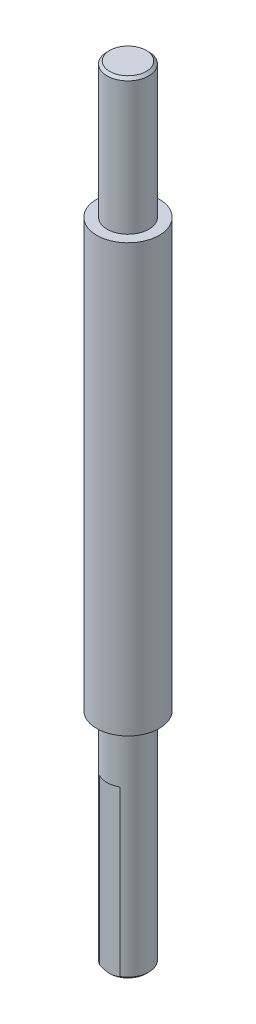
ISO-10303-21;
HEADER;
FILE_DESCRIPTION(('STEP AP214'),'2;1');
FILE_NAME('part.step','',(''),(''),'','','');
FILE_SCHEMA(('AUTOMOTIVE_DESIGN { 1 0 10303 214 1 1 1 1 }'));
ENDSEC;
DATA;
#1=APPLICATION_CONTEXT('core data for automotive mechanical design processes');
#2=APPLICATION_PROTOCOL_DEFINITION('international standard','automotive_design',2000,#1);
#3=PRODUCT_CONTEXT('',#1,'mechanical');
#4=PRODUCT('Part','Part','',(#3));
#5=PRODUCT_RELATED_PRODUCT_CATEGORY('part','',(#4));
#6=PRODUCT_DEFINITION_FORMATION('','',#4);
#7=PRODUCT_DEFINITION_CONTEXT('part definition',#1,'design');
#8=PRODUCT_DEFINITION('design','',#6,#7);
#9=PRODUCT_DEFINITION_SHAPE('','',#8);
#10=(LENGTH_UNIT() NAMED_UNIT(*) SI_UNIT(.MILLI.,.METRE.));
#11=(NAMED_UNIT(*) PLANE_ANGLE_UNIT() SI_UNIT($,.RADIAN.));
#12=(NAMED_UNIT(*) SI_UNIT($,.STERADIAN.) SOLID_ANGLE_UNIT());
#13=UNCERTAINTY_MEASURE_WITH_UNIT(LENGTH_MEASURE(1.E-05),#10,'distance_accuracy_value','');
#14=(GEOMETRIC_REPRESENTATION_CONTEXT(3) GLOBAL_UNCERTAINTY_ASSIGNED_CONTEXT((#13)) GLOBAL_UNIT_ASSIGNED_CONTEXT((#10,
#11,#12)) REPRESENTATION_CONTEXT('',''));
#15=CARTESIAN_POINT('',(0.,0.,0.));
#16=DIRECTION('',(0.,0.,1.));
#17=DIRECTION('',(1.,0.,0.));
#18=AXIS2_PLACEMENT_3D('',#15,#16,#17);
#19=CARTESIAN_POINT('',(0.,150.,0.));
#20=DIRECTION('',(0.,-1.,0.));
#21=DIRECTION('',(0.,0.,-1.));
#22=AXIS2_PLACEMENT_3D('',#19,#20,#21);
#23=CYLINDRICAL_SURFACE('',#22,6.);
#24=CARTESIAN_POINT('',(0.,42.,0.));
#25=DIRECTION('',(0.,1.,0.));
#26=DIRECTION('',(0.,0.,1.));
#27=AXIS2_PLACEMENT_3D('',#24,#25,#26);
#28=CIRCLE('',#27,6.);
#29=CARTESIAN_POINT('',(0.,42.,6.));
#30=VERTEX_POINT('',#29);
#31=EDGE_CURVE('E92',#30,#30,#28,.T.);
#32=ORIENTED_EDGE('',*,*,#31,.T.);
#33=EDGE_LOOP('',(#32));
#34=FACE_BOUND('',#33,.T.);
#35=CARTESIAN_POINT('',(0.,124.,0.));
#36=DIRECTION('',(0.,1.,0.));
#37=DIRECTION('',(0.,0.,1.));
#38=AXIS2_PLACEMENT_3D('',#35,#36,#37);
#39=CIRCLE('',#38,6.);
#40=CARTESIAN_POINT('',(0.,124.,6.));
#41=VERTEX_POINT('',#40);
#42=EDGE_CURVE('E77',#41,#41,#39,.T.);
#43=ORIENTED_EDGE('',*,*,#42,.F.);
#44=EDGE_LOOP('',(#43));
#45=FACE_BOUND('',#44,.T.);
#46=ADVANCED_FACE('F39',(#34,#45),#23,.T.);
#47=CARTESIAN_POINT('',(0.,124.,0.));
#48=DIRECTION('',(0.,1.,0.));
#49=DIRECTION('',(0.,0.,1.));
#50=AXIS2_PLACEMENT_3D('',#47,#48,#49);
#51=PLANE('',#50);
#52=CARTESIAN_POINT('',(0.,124.,0.));
#53=DIRECTION('',(0.,1.,0.));
#54=DIRECTION('',(0.,0.,1.));
#55=AXIS2_PLACEMENT_3D('',#52,#53,#54);
#56=CIRCLE('',#55,4.);
#57=CARTESIAN_POINT('',(0.,124.,4.));
#58=VERTEX_POINT('',#57);
#59=EDGE_CURVE('E93',#58,#58,#56,.T.);
#60=ORIENTED_EDGE('',*,*,#59,.F.);
#61=EDGE_LOOP('',(#60));
#62=FACE_BOUND('',#61,.T.);
#63=ORIENTED_EDGE('',*,*,#42,.T.);
#64=EDGE_LOOP('',(#63));
#65=FACE_BOUND('',#64,.T.);
#66=ADVANCED_FACE('F131',(#62,#65),#51,.T.);
#67=CARTESIAN_POINT('',(0.,124.,0.));
#68=DIRECTION('',(0.,1.,0.));
#69=DIRECTION('',(0.,0.,1.));
#70=AXIS2_PLACEMENT_3D('',#67,#68,#69);
#71=CYLINDRICAL_SURFACE('',#70,4.);
#72=CARTESIAN_POINT('',(0.,149.5,0.));
#73=DIRECTION('',(0.,1.,0.));
#74=DIRECTION('',(0.,0.,1.));
#75=AXIS2_PLACEMENT_3D('',#72,#73,#74);
#76=CIRCLE('',#75,4.);
#77=CARTESIAN_POINT('',(0.,149.5,4.));
#78=VERTEX_POINT('',#77);
#79=EDGE_CURVE('E13',#78,#78,#76,.F.);
#80=CARTESIAN_POINT('',(0.,149.5,4.));
#81=CARTESIAN_POINT('',(0.,149.234375,4.));
#82=CARTESIAN_POINT('',(0.,148.96875,4.));
#83=CARTESIAN_POINT('',(0.,148.4375,4.));
#84=CARTESIAN_POINT('',(0.,148.171875,4.));
#85=CARTESIAN_POINT('',(0.,147.640625,4.));
#86=CARTESIAN_POINT('',(0.,147.375,4.));
#87=CARTESIAN_POINT('',(0.,146.84375,4.));
#88=CARTESIAN_POINT('',(0.,146.578125,4.));
#89=CARTESIAN_POINT('',(0.,146.046875,4.));
#90=CARTESIAN_POINT('',(0.,145.78125,4.));
#91=CARTESIAN_POINT('',(0.,145.25,4.));
#92=CARTESIAN_POINT('',(0.,144.984375,4.));
#93=CARTESIAN_POINT('',(0.,144.453125,4.));
#94=CARTESIAN_POINT('',(0.,144.1875,4.));
#95=CARTESIAN_POINT('',(0.,143.65625,4.));
#96=CARTESIAN_POINT('',(0.,143.390625,4.));
#97=CARTESIAN_POINT('',(0.,142.859375,4.));
#98=CARTESIAN_POINT('',(0.,142.59375,4.));
#99=CARTESIAN_POINT('',(0.,142.0625,4.));
#100=CARTESIAN_POINT('',(0.,141.796875,4.));
#101=CARTESIAN_POINT('',(0.,141.265625,4.));
#102=CARTESIAN_POINT('',(0.,141.,4.));
#103=CARTESIAN_POINT('',(0.,140.46875,4.));
#104=CARTESIAN_POINT('',(0.,140.203125,4.));
#105=CARTESIAN_POINT('',(0.,139.671875,4.));
#106=CARTESIAN_POINT('',(0.,139.40625,4.));
#107=CARTESIAN_POINT('',(0.,138.875,4.));
#108=CARTESIAN_POINT('',(0.,138.609375,4.));
#109=CARTESIAN_POINT('',(0.,138.078125,4.));
#110=CARTESIAN_POINT('',(0.,137.8125,4.));
#111=CARTESIAN_POINT('',(0.,137.28125,4.));
#112=CARTESIAN_POINT('',(0.,137.015625,4.));
#113=CARTESIAN_POINT('',(0.,136.484375,4.));
#114=CARTESIAN_POINT('',(0.,136.21875,4.));
#115=CARTESIAN_POINT('',(0.,135.6875,4.));
#116=CARTESIAN_POINT('',(0.,135.421875,4.));
#117=CARTESIAN_POINT('',(0.,134.890625,4.));
#118=CARTESIAN_POINT('',(0.,134.625,4.));
#119=CARTESIAN_POINT('',(0.,134.09375,4.));
#120=CARTESIAN_POINT('',(0.,133.828125,4.));
#121=CARTESIAN_POINT('',(0.,133.296875,4.));
#122=CARTESIAN_POINT('',(0.,133.03125,4.));
#123=CARTESIAN_POINT('',(0.,132.5,4.));
#124=CARTESIAN_POINT('',(0.,132.234375,4.));
#125=CARTESIAN_POINT('',(0.,131.703125,4.));
#126=CARTESIAN_POINT('',(0.,131.4375,4.));
#127=CARTESIAN_POINT('',(0.,130.90625,4.));
#128=CARTESIAN_POINT('',(0.,130.640625,4.));
#129=CARTESIAN_POINT('',(0.,130.109375,4.));
#130=CARTESIAN_POINT('',(0.,129.84375,4.));
#131=CARTESIAN_POINT('',(0.,129.3125,4.));
#132=CARTESIAN_POINT('',(0.,129.046875,4.));
#133=CARTESIAN_POINT('',(0.,128.515625,4.));
#134=CARTESIAN_POINT('',(0.,128.25,4.));
#135=CARTESIAN_POINT('',(0.,127.71875,4.));
#136=CARTESIAN_POINT('',(0.,127.453125,4.));
#137=CARTESIAN_POINT('',(0.,126.921875,4.));
#138=CARTESIAN_POINT('',(0.,126.65625,4.));
#139=CARTESIAN_POINT('',(0.,126.125,4.));
#140=CARTESIAN_POINT('',(0.,125.859375,4.));
#141=CARTESIAN_POINT('',(0.,125.328125,4.));
#142=CARTESIAN_POINT('',(0.,125.0625,4.));
#143=CARTESIAN_POINT('',(0.,124.53125,4.));
#144=CARTESIAN_POINT('',(0.,124.265625,4.));
#145=CARTESIAN_POINT('',(0.,124.,4.));
#146=B_SPLINE_CURVE_WITH_KNOTS('',3,(#80,#81,#82,#83,#84,#85,#86,#87,#88,#89,#90,#91,#92,#93,
#94,#95,#96,#97,#98,#99,#100,#101,#102,#103,#104,#105,#106,#107,#108,#109,#110,#111,#112,#113,
#114,#115,#116,#117,#118,#119,#120,#121,#122,#123,#124,#125,#126,#127,#128,#129,#130,#131,#132,
#133,#134,#135,#136,#137,#138,#139,#140,#141,#142,#143,#144,#145),.UNSPECIFIED.,.F.,.F.,(4,2,2,
2,2,2,2,2,2,2,2,2,2,2,2,2,2,2,2,2,2,2,2,2,2,2,2,2,2,2,2,2,4),(0.,0.796875000000002,1.59375,
2.39062500000001,3.18750000000001,3.98437500000001,4.78125000000001,5.57812500000002,
6.37500000000002,7.17187500000002,7.96875000000002,8.76562500000003,9.5625,10.359375,11.15625,
11.953125,12.75,13.546875,14.34375,15.140625,15.9375,16.734375,17.53125,18.328125,19.125,
19.921875,20.71875,21.515625,22.3125,23.109375,23.90625,24.7031250000001,25.5),.UNSPECIFIED.);
#147=EDGE_CURVE('BSEAM128',#78,#58,#146,.T.);
#148=ORIENTED_EDGE('',*,*,#79,.T.);
#149=ORIENTED_EDGE('',*,*,#59,.T.);
#150=ORIENTED_EDGE('',*,*,#147,.T.);
#151=ORIENTED_EDGE('',*,*,#147,.F.);
#152=EDGE_LOOP('',(#148,#150,#149,#151));
#153=FACE_BOUND('',#152,.T.);
#154=ADVANCED_FACE('F128',(#153),#71,.T.);
#155=CARTESIAN_POINT('',(0.,150.,0.));
#156=DIRECTION('',(0.,1.,0.));
#157=DIRECTION('',(0.,0.,1.));
#158=AXIS2_PLACEMENT_3D('',#155,#156,#157);
#159=PLANE('',#158);
#160=CARTESIAN_POINT('',(0.,150.,0.));
#161=DIRECTION('',(0.,1.,0.));
#162=DIRECTION('',(0.,0.,1.));
#163=AXIS2_PLACEMENT_3D('',#160,#161,#162);
#164=CIRCLE('',#163,3.50000000000009);
#165=CARTESIAN_POINT('',(0.,150.,3.50000000000009));
#166=VERTEX_POINT('',#165);
#167=EDGE_CURVE('E47',#166,#166,#164,.T.);
#168=ORIENTED_EDGE('',*,*,#167,.T.);
#169=EDGE_LOOP('',(#168));
#170=FACE_BOUND('',#169,.T.);
#171=ADVANCED_FACE('F126',(#170),#159,.T.);
#172=CARTESIAN_POINT('',(0.,42.,0.));
#173=DIRECTION('',(0.,1.,0.));
#174=DIRECTION('',(0.,0.,1.));
#175=AXIS2_PLACEMENT_3D('',#172,#173,#174);
#176=PLANE('',#175);
#177=CARTESIAN_POINT('',(0.,42.,0.));
#178=DIRECTION('',(0.,1.,0.));
#179=DIRECTION('',(0.,0.,1.));
#180=AXIS2_PLACEMENT_3D('',#177,#178,#179);
#181=CIRCLE('',#180,4.);
#182=CARTESIAN_POINT('',(0.,42.,4.));
#183=VERTEX_POINT('',#182);
#184=EDGE_CURVE('E87',#183,#183,#181,.F.);
#185=ORIENTED_EDGE('',*,*,#184,.F.);
#186=EDGE_LOOP('',(#185));
#187=FACE_BOUND('',#186,.T.);
#188=ORIENTED_EDGE('',*,*,#31,.F.);
#189=EDGE_LOOP('',(#188));
#190=FACE_BOUND('',#189,.T.);
#191=ADVANCED_FACE('F123',(#187,#190),#176,.F.);
#192=CARTESIAN_POINT('',(0.,141.140268375962,0.));
#193=DIRECTION('',(0.,-1.,0.));
#194=DIRECTION('',(0.,0.,-1.));
#195=AXIS2_PLACEMENT_3D('',#192,#193,#194);
#196=CYLINDRICAL_SURFACE('',#195,4.);
#197=DIRECTION('',(0.,-1.,0.));
#198=VECTOR('',#197,1.);
#199=CARTESIAN_POINT('',(1.93649167310371,141.140268375962,3.5));
#200=LINE('',#199,#198);
#201=CARTESIAN_POINT('',(1.93649167310371,0.499999999999973,3.5));
#202=VERTEX_POINT('',#201);
#203=CARTESIAN_POINT('',(1.93649167310371,32.,3.5));
#204=VERTEX_POINT('',#203);
#205=EDGE_CURVE('E82',#202,#204,#200,.F.);
#206=ORIENTED_EDGE('',*,*,#205,.F.);
#207=CARTESIAN_POINT('',(0.,0.499999999999973,0.));
#208=DIRECTION('',(0.,1.,0.));
#209=DIRECTION('',(0.,0.,1.));
#210=AXIS2_PLACEMENT_3D('',#207,#208,#209);
#211=CIRCLE('',#210,4.);
#212=CARTESIAN_POINT('',(-1.93649167310371,0.499999999999972,3.5));
#213=VERTEX_POINT('',#212);
#214=EDGE_CURVE('E54',#202,#213,#211,.T.);
#215=ORIENTED_EDGE('',*,*,#214,.T.);
#216=DIRECTION('',(0.,-1.,0.));
#217=VECTOR('',#216,1.);
#218=CARTESIAN_POINT('',(-1.93649167310371,141.140268375962,3.5));
#219=LINE('',#218,#217);
#220=CARTESIAN_POINT('',(-1.93649167310371,32.,3.5));
#221=VERTEX_POINT('',#220);
#222=EDGE_CURVE('E80',#221,#213,#219,.T.);
#223=ORIENTED_EDGE('',*,*,#222,.F.);
#224=CARTESIAN_POINT('',(0.,32.,0.));
#225=DIRECTION('',(0.,1.,0.));
#226=DIRECTION('',(0.,0.,1.));
#227=AXIS2_PLACEMENT_3D('',#224,#225,#226);
#228=CIRCLE('',#227,4.);
#229=EDGE_CURVE('E72',#204,#221,#228,.F.);
#230=ORIENTED_EDGE('',*,*,#229,.F.);
#231=EDGE_LOOP('',(#206,#215,#223,#230));
#232=FACE_BOUND('',#231,.T.);
#233=ORIENTED_EDGE('',*,*,#184,.T.);
#234=EDGE_LOOP('',(#233));
#235=FACE_BOUND('',#234,.T.);
#236=ADVANCED_FACE('F84',(#232,#235),#196,.T.);
#237=CARTESIAN_POINT('',(0.,0.,0.));
#238=DIRECTION('',(0.,1.,0.));
#239=DIRECTION('',(0.,0.,1.));
#240=AXIS2_PLACEMENT_3D('',#237,#238,#239);
#241=PLANE('',#240);
#242=CARTESIAN_POINT('',(0.,0.,0.));
#243=DIRECTION('',(0.,1.,0.));
#244=DIRECTION('',(0.,0.,1.));
#245=AXIS2_PLACEMENT_3D('',#242,#243,#244);
#246=CIRCLE('',#245,3.50000000000003);
#247=CARTESIAN_POINT('',(0.,0.,3.5));
#248=VERTEX_POINT('',#247);
#249=EDGE_CURVE('E76',#248,#248,#246,.F.);
#250=ORIENTED_EDGE('',*,*,#249,.T.);
#251=EDGE_LOOP('',(#250));
#252=FACE_BOUND('',#251,.T.);
#253=ADVANCED_FACE('F122',(#252),#241,.F.);
#254=CARTESIAN_POINT('',(-5.,32.,4.));
#255=DIRECTION('',(0.,1.,0.));
#256=DIRECTION('',(0.,0.,1.));
#257=AXIS2_PLACEMENT_3D('',#254,#255,#256);
#258=PLANE('',#257);
#259=ORIENTED_EDGE('',*,*,#229,.T.);
#260=DIRECTION('',(1.,0.,0.));
#261=VECTOR('',#260,1.);
#262=CARTESIAN_POINT('',(-5.,32.,3.5));
#263=LINE('',#262,#261);
#264=EDGE_CURVE('E75',#221,#204,#263,.T.);
#265=ORIENTED_EDGE('',*,*,#264,.T.);
#266=EDGE_LOOP('',(#259,#265));
#267=FACE_BOUND('',#266,.T.);
#268=ADVANCED_FACE('F74',(#267),#258,.F.);
#269=CARTESIAN_POINT('',(-5.,0.,3.5));
#270=DIRECTION('',(0.,0.,-1.));
#271=DIRECTION('',(-1.,0.,0.));
#272=AXIS2_PLACEMENT_3D('',#269,#270,#271);
#273=PLANE('',#272);
#274=CARTESIAN_POINT('',(-1.93649167310371,0.499999999999973,3.5));
#275=CARTESIAN_POINT('',(-1.80164497176726,0.434762736264771,3.5));
#276=CARTESIAN_POINT('',(-1.66457098308315,0.373575206678276,3.5));
#277=CARTESIAN_POINT('',(-1.3852404622089,0.261956754370343,3.5));
#278=CARTESIAN_POINT('',(-1.24295879634616,0.211589280169158,3.5));
#279=CARTESIAN_POINT('',(-0.957964142076907,0.126260870362071,3.5));
#280=CARTESIAN_POINT('',(-0.815368580178064,0.090917476737428,3.5));
#281=CARTESIAN_POINT('',(-0.527355180962293,0.0366982875440566,3.5));
#282=CARTESIAN_POINT('',(-0.381946364669726,0.0177766566297322,3.5));
#283=CARTESIAN_POINT('',(-0.196806714012733,0.00530798053622142,3.5));
#284=CARTESIAN_POINT('',(-0.157558468243221,0.00332378975403941,3.5));
#285=CARTESIAN_POINT('',(-0.0788758838910602,0.000668017114313632,3.5));
#286=CARTESIAN_POINT('',(-0.0394413847077868,1.19563668863626E-06,3.5));
#287=CARTESIAN_POINT('',(0.,0.,3.5));
#288=B_SPLINE_CURVE_WITH_KNOTS('',3,(#274,#275,#276,#277,#278,#279,#280,#281,#282,#283,#284,
#285,#286,#287),.UNSPECIFIED.,.F.,.F.,(4,2,2,2,2,2,4),(0.,0.449696578012148,0.901962231908636,
1.34190254514454,1.78061093996758,1.89849062730155,2.0167955052743),.UNSPECIFIED.);
#289=EDGE_CURVE('E102',#213,#248,#288,.T.);
#290=ORIENTED_EDGE('',*,*,#289,.T.);
#291=CARTESIAN_POINT('',(0.,0.,3.50000000000003));
#292=CARTESIAN_POINT('',(0.0537467282966543,-4.29922065979948E-06,3.50000000000001));
#293=CARTESIAN_POINT('',(0.107485412101769,0.00123864077939596,3.5));
#294=CARTESIAN_POINT('',(0.214841712901827,0.00617848493376682,3.5));
#295=CARTESIAN_POINT('',(0.268459347534048,0.00987500485912036,3.5));
#296=CARTESIAN_POINT('',(0.428791077671287,0.0245657678789658,3.5));
#297=CARTESIAN_POINT('',(0.535193061064634,0.0391615281616906,3.5));
#298=CARTESIAN_POINT('',(0.744803501539115,0.0769040576639624,3.5));
#299=CARTESIAN_POINT('',(0.848035915186262,0.0999213294214952,3.5));
#300=CARTESIAN_POINT('',(1.0525393895166,0.153504515137779,3.5));
#301=CARTESIAN_POINT('',(1.15380989215637,0.18407254378979,3.5));
#302=CARTESIAN_POINT('',(1.31208196831693,0.23745419760917,3.5));
#303=CARTESIAN_POINT('',(1.36981851759891,0.258135170576297,3.5));
#304=CARTESIAN_POINT('',(1.48453880356191,0.301451836388279,3.5));
#305=CARTESIAN_POINT('',(1.54152272248367,0.324087045648071,3.5));
#306=CARTESIAN_POINT('',(1.65526327998893,0.371329804603531,3.5));
#307=CARTESIAN_POINT('',(1.71201329446651,0.39595322547491,3.5));
#308=CARTESIAN_POINT('',(1.82479000868548,0.446812715501859,3.5));
#309=CARTESIAN_POINT('',(1.8808166759541,0.473048856753734,3.5));
#310=CARTESIAN_POINT('',(1.93649167310371,0.499999999999972,3.5));
#311=B_SPLINE_CURVE_WITH_KNOTS('',3,(#291,#292,#293,#294,#295,#296,#297,#298,#299,#300,#301,
#302,#303,#304,#305,#306,#307,#308,#309,#310),.UNSPECIFIED.,.F.,.F.,(4,2,2,2,2,2,2,2,2,4),(0.,
0.161210431703255,0.322395623915903,0.644141179095858,0.961134016818524,1.27821573359943,
1.46217088394503,1.64608064347332,1.8316401359309,2.01720792982576),.UNSPECIFIED.);
#312=EDGE_CURVE('E62',#248,#202,#311,.T.);
#313=ORIENTED_EDGE('',*,*,#312,.T.);
#314=ORIENTED_EDGE('',*,*,#205,.T.);
#315=ORIENTED_EDGE('',*,*,#264,.F.);
#316=ORIENTED_EDGE('',*,*,#222,.T.);
#317=EDGE_LOOP('',(#290,#313,#314,#315,#316));
#318=FACE_BOUND('',#317,.T.);
#319=ADVANCED_FACE('F79',(#318),#273,.F.);
#320=CARTESIAN_POINT('',(0.,0.,0.));
#321=DIRECTION('',(0.,1.,0.));
#322=DIRECTION('',(0.,0.,1.));
#323=AXIS2_PLACEMENT_3D('',#320,#321,#322);
#324=CONICAL_SURFACE('',#323,3.50000000000003,0.785398163397445);
#325=ORIENTED_EDGE('',*,*,#289,.F.);
#326=ORIENTED_EDGE('',*,*,#214,.F.);
#327=ORIENTED_EDGE('',*,*,#312,.F.);
#328=ORIENTED_EDGE('',*,*,#249,.F.);
#329=EDGE_LOOP('',(#325,#326,#327,#328));
#330=FACE_BOUND('',#329,.T.);
#331=ADVANCED_FACE('F112',(#330),#324,.T.);
#332=CARTESIAN_POINT('',(0.,150.,0.));
#333=DIRECTION('',(0.,-1.,0.));
#334=DIRECTION('',(0.,0.,-1.));
#335=AXIS2_PLACEMENT_3D('',#332,#333,#334);
#336=CONICAL_SURFACE('',#335,3.50000000000009,0.785398163397446);
#337=ORIENTED_EDGE('',*,*,#79,.F.);
#338=EDGE_LOOP('',(#337));
#339=FACE_BOUND('',#338,.T.);
#340=ORIENTED_EDGE('',*,*,#167,.F.);
#341=EDGE_LOOP('',(#340));
#342=FACE_BOUND('',#341,.T.);
#343=ADVANCED_FACE('F41',(#339,#342),#336,.T.);
#344=CLOSED_SHELL('',(#46,#66,#154,#171,#191,#236,#253,#268,#319,#331,#343));
#345=MANIFOLD_SOLID_BREP('B2',#344);
#346=ADVANCED_BREP_SHAPE_REPRESENTATION('',(#18,#345),#14);
#347=SHAPE_DEFINITION_REPRESENTATION(#9,#346);
ENDSEC;
END-ISO-10303-21;
